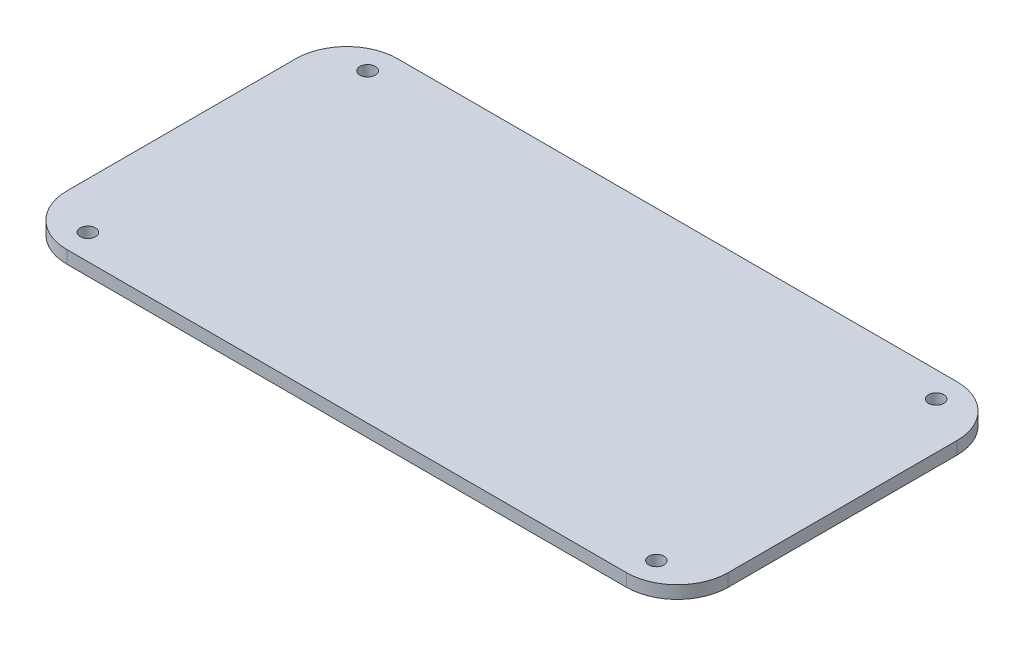
ISO-10303-21;
HEADER;
FILE_DESCRIPTION(('STEP AP214'),'2;1');
FILE_NAME('part.step','',(''),(''),'','','');
FILE_SCHEMA(('AUTOMOTIVE_DESIGN { 1 0 10303 214 1 1 1 1 }'));
ENDSEC;
DATA;
#1=APPLICATION_CONTEXT('core data for automotive mechanical design processes');
#2=APPLICATION_PROTOCOL_DEFINITION('international standard','automotive_design',2000,#1);
#3=PRODUCT_CONTEXT('',#1,'mechanical');
#4=PRODUCT('Part','Part','',(#3));
#5=PRODUCT_RELATED_PRODUCT_CATEGORY('part','',(#4));
#6=PRODUCT_DEFINITION_FORMATION('','',#4);
#7=PRODUCT_DEFINITION_CONTEXT('part definition',#1,'design');
#8=PRODUCT_DEFINITION('design','',#6,#7);
#9=PRODUCT_DEFINITION_SHAPE('','',#8);
#10=(LENGTH_UNIT() NAMED_UNIT(*) SI_UNIT(.MILLI.,.METRE.));
#11=(NAMED_UNIT(*) PLANE_ANGLE_UNIT() SI_UNIT($,.RADIAN.));
#12=(NAMED_UNIT(*) SI_UNIT($,.STERADIAN.) SOLID_ANGLE_UNIT());
#13=UNCERTAINTY_MEASURE_WITH_UNIT(LENGTH_MEASURE(1.E-05),#10,'distance_accuracy_value','');
#14=(GEOMETRIC_REPRESENTATION_CONTEXT(3) GLOBAL_UNCERTAINTY_ASSIGNED_CONTEXT((#13)) GLOBAL_UNIT_ASSIGNED_CONTEXT((#10,
#11,#12)) REPRESENTATION_CONTEXT('',''));
#15=CARTESIAN_POINT('',(0.,0.,0.));
#16=DIRECTION('',(0.,0.,1.));
#17=DIRECTION('',(1.,0.,0.));
#18=AXIS2_PLACEMENT_3D('',#15,#16,#17);
#19=CARTESIAN_POINT('',(10.,2.5,-55.));
#20=DIRECTION('',(0.,-1.,0.));
#21=DIRECTION('',(0.,0.,-1.));
#22=AXIS2_PLACEMENT_3D('',#19,#20,#21);
#23=CYLINDRICAL_SURFACE('',#22,10.);
#24=CARTESIAN_POINT('',(10.,0.,-55.));
#25=DIRECTION('',(0.,1.,0.));
#26=DIRECTION('',(0.,0.,1.));
#27=AXIS2_PLACEMENT_3D('',#24,#25,#26);
#28=CIRCLE('',#27,10.);
#29=CARTESIAN_POINT('',(10.,0.,-65.));
#30=VERTEX_POINT('',#29);
#31=CARTESIAN_POINT('',(0.,0.,-55.));
#32=VERTEX_POINT('',#31);
#33=EDGE_CURVE('E145',#30,#32,#28,.T.);
#34=ORIENTED_EDGE('',*,*,#33,.T.);
#35=DIRECTION('',(0.,-1.,0.));
#36=VECTOR('',#35,1.);
#37=CARTESIAN_POINT('',(0.,2.5,-55.));
#38=LINE('',#37,#36);
#39=CARTESIAN_POINT('',(0.,2.5,-55.));
#40=VERTEX_POINT('',#39);
#41=EDGE_CURVE('E11',#40,#32,#38,.T.);
#42=ORIENTED_EDGE('',*,*,#41,.F.);
#43=CARTESIAN_POINT('',(10.,2.5,-55.));
#44=DIRECTION('',(0.,1.,0.));
#45=DIRECTION('',(0.,0.,1.));
#46=AXIS2_PLACEMENT_3D('',#43,#44,#45);
#47=CIRCLE('',#46,10.);
#48=CARTESIAN_POINT('',(10.,2.5,-65.));
#49=VERTEX_POINT('',#48);
#50=EDGE_CURVE('E168',#49,#40,#47,.T.);
#51=ORIENTED_EDGE('',*,*,#50,.F.);
#52=DIRECTION('',(0.,-1.,0.));
#53=VECTOR('',#52,1.);
#54=CARTESIAN_POINT('',(10.,2.5,-65.));
#55=LINE('',#54,#53);
#56=EDGE_CURVE('E141',#49,#30,#55,.T.);
#57=ORIENTED_EDGE('',*,*,#56,.T.);
#58=EDGE_LOOP('',(#34,#42,#51,#57));
#59=FACE_BOUND('',#58,.T.);
#60=ADVANCED_FACE('F44',(#59),#23,.T.);
#61=CARTESIAN_POINT('',(0.,2.5,-10.0000000000001));
#62=DIRECTION('',(1.,0.,0.));
#63=DIRECTION('',(0.,0.,-1.));
#64=AXIS2_PLACEMENT_3D('',#61,#62,#63);
#65=PLANE('',#64);
#66=DIRECTION('',(0.,0.,1.));
#67=VECTOR('',#66,1.);
#68=CARTESIAN_POINT('',(0.,0.,-10.0000000000001));
#69=LINE('',#68,#67);
#70=CARTESIAN_POINT('',(0.,0.,-10.0000000000001));
#71=VERTEX_POINT('',#70);
#72=EDGE_CURVE('E149',#32,#71,#69,.T.);
#73=ORIENTED_EDGE('',*,*,#72,.T.);
#74=DIRECTION('',(0.,-1.,0.));
#75=VECTOR('',#74,1.);
#76=CARTESIAN_POINT('',(0.,2.5,-10.0000000000001));
#77=LINE('',#76,#75);
#78=CARTESIAN_POINT('',(0.,2.5,-10.0000000000001));
#79=VERTEX_POINT('',#78);
#80=EDGE_CURVE('E53',#79,#71,#77,.T.);
#81=ORIENTED_EDGE('',*,*,#80,.F.);
#82=DIRECTION('',(0.,0.,1.));
#83=VECTOR('',#82,1.);
#84=CARTESIAN_POINT('',(0.,2.5,-10.0000000000001));
#85=LINE('',#84,#83);
#86=EDGE_CURVE('E104',#40,#79,#85,.T.);
#87=ORIENTED_EDGE('',*,*,#86,.F.);
#88=ORIENTED_EDGE('',*,*,#41,.T.);
#89=EDGE_LOOP('',(#73,#81,#87,#88));
#90=FACE_BOUND('',#89,.T.);
#91=ADVANCED_FACE('F277',(#90),#65,.F.);
#92=CARTESIAN_POINT('',(10.,2.5,-10.));
#93=DIRECTION('',(0.,-1.,0.));
#94=DIRECTION('',(0.,0.,-1.));
#95=AXIS2_PLACEMENT_3D('',#92,#93,#94);
#96=CYLINDRICAL_SURFACE('',#95,10.);
#97=CARTESIAN_POINT('',(10.,0.,-10.));
#98=DIRECTION('',(0.,1.,0.));
#99=DIRECTION('',(0.,0.,1.));
#100=AXIS2_PLACEMENT_3D('',#97,#98,#99);
#101=CIRCLE('',#100,10.);
#102=CARTESIAN_POINT('',(10.0000000000001,0.,0.));
#103=VERTEX_POINT('',#102);
#104=EDGE_CURVE('E153',#71,#103,#101,.T.);
#105=ORIENTED_EDGE('',*,*,#104,.T.);
#106=DIRECTION('',(0.,-1.,0.));
#107=VECTOR('',#106,1.);
#108=CARTESIAN_POINT('',(10.0000000000001,2.5,0.));
#109=LINE('',#108,#107);
#110=CARTESIAN_POINT('',(10.0000000000001,2.5,0.));
#111=VERTEX_POINT('',#110);
#112=EDGE_CURVE('E179',#111,#103,#109,.T.);
#113=ORIENTED_EDGE('',*,*,#112,.F.);
#114=CARTESIAN_POINT('',(10.,2.5,-10.));
#115=DIRECTION('',(0.,1.,0.));
#116=DIRECTION('',(0.,0.,1.));
#117=AXIS2_PLACEMENT_3D('',#114,#115,#116);
#118=CIRCLE('',#117,10.);
#119=EDGE_CURVE('E189',#79,#111,#118,.T.);
#120=ORIENTED_EDGE('',*,*,#119,.F.);
#121=ORIENTED_EDGE('',*,*,#80,.T.);
#122=EDGE_LOOP('',(#105,#113,#120,#121));
#123=FACE_BOUND('',#122,.T.);
#124=ADVANCED_FACE('F187',(#123),#96,.T.);
#125=CARTESIAN_POINT('',(10.0000000000001,2.5,0.));
#126=DIRECTION('',(0.,0.,-1.));
#127=DIRECTION('',(-1.,0.,0.));
#128=AXIS2_PLACEMENT_3D('',#125,#126,#127);
#129=PLANE('',#128);
#130=DIRECTION('',(1.,0.,0.));
#131=VECTOR('',#130,1.);
#132=CARTESIAN_POINT('',(10.0000000000001,0.,0.));
#133=LINE('',#132,#131);
#134=CARTESIAN_POINT('',(120.,0.,0.));
#135=VERTEX_POINT('',#134);
#136=EDGE_CURVE('E156',#103,#135,#133,.T.);
#137=ORIENTED_EDGE('',*,*,#136,.T.);
#138=DIRECTION('',(0.,-1.,0.));
#139=VECTOR('',#138,1.);
#140=CARTESIAN_POINT('',(120.,2.5,0.));
#141=LINE('',#140,#139);
#142=CARTESIAN_POINT('',(120.,2.5,0.));
#143=VERTEX_POINT('',#142);
#144=EDGE_CURVE('E175',#143,#135,#141,.T.);
#145=ORIENTED_EDGE('',*,*,#144,.F.);
#146=DIRECTION('',(1.,0.,0.));
#147=VECTOR('',#146,1.);
#148=CARTESIAN_POINT('',(10.0000000000001,2.5,0.));
#149=LINE('',#148,#147);
#150=EDGE_CURVE('E202',#111,#143,#149,.T.);
#151=ORIENTED_EDGE('',*,*,#150,.F.);
#152=ORIENTED_EDGE('',*,*,#112,.T.);
#153=EDGE_LOOP('',(#137,#145,#151,#152));
#154=FACE_BOUND('',#153,.T.);
#155=ADVANCED_FACE('F197',(#154),#129,.F.);
#156=CARTESIAN_POINT('',(120.,2.5,-10.));
#157=DIRECTION('',(0.,-1.,0.));
#158=DIRECTION('',(0.,0.,-1.));
#159=AXIS2_PLACEMENT_3D('',#156,#157,#158);
#160=CYLINDRICAL_SURFACE('',#159,10.);
#161=CARTESIAN_POINT('',(120.,0.,-10.));
#162=DIRECTION('',(0.,1.,0.));
#163=DIRECTION('',(0.,0.,-1.));
#164=AXIS2_PLACEMENT_3D('',#161,#162,#163);
#165=CIRCLE('',#164,10.);
#166=CARTESIAN_POINT('',(130.,0.,-10.0000000000001));
#167=VERTEX_POINT('',#166);
#168=EDGE_CURVE('E159',#135,#167,#165,.T.);
#169=ORIENTED_EDGE('',*,*,#168,.T.);
#170=DIRECTION('',(0.,-1.,0.));
#171=VECTOR('',#170,1.);
#172=CARTESIAN_POINT('',(130.,2.5,-10.0000000000001));
#173=LINE('',#172,#171);
#174=CARTESIAN_POINT('',(130.,2.5,-10.0000000000001));
#175=VERTEX_POINT('',#174);
#176=EDGE_CURVE('E134',#175,#167,#173,.T.);
#177=ORIENTED_EDGE('',*,*,#176,.F.);
#178=CARTESIAN_POINT('',(120.,2.5,-10.));
#179=DIRECTION('',(0.,1.,0.));
#180=DIRECTION('',(0.,0.,-1.));
#181=AXIS2_PLACEMENT_3D('',#178,#179,#180);
#182=CIRCLE('',#181,10.);
#183=EDGE_CURVE('E123',#143,#175,#182,.T.);
#184=ORIENTED_EDGE('',*,*,#183,.F.);
#185=ORIENTED_EDGE('',*,*,#144,.T.);
#186=EDGE_LOOP('',(#169,#177,#184,#185));
#187=FACE_BOUND('',#186,.T.);
#188=ADVANCED_FACE('F200',(#187),#160,.T.);
#189=CARTESIAN_POINT('',(130.,2.5,-10.0000000000001));
#190=DIRECTION('',(-1.,0.,0.));
#191=DIRECTION('',(0.,0.,1.));
#192=AXIS2_PLACEMENT_3D('',#189,#190,#191);
#193=PLANE('',#192);
#194=DIRECTION('',(0.,0.,-1.));
#195=VECTOR('',#194,1.);
#196=CARTESIAN_POINT('',(130.,0.,-10.0000000000001));
#197=LINE('',#196,#195);
#198=CARTESIAN_POINT('',(130.,0.,-55.));
#199=VERTEX_POINT('',#198);
#200=EDGE_CURVE('E132',#167,#199,#197,.T.);
#201=ORIENTED_EDGE('',*,*,#200,.T.);
#202=DIRECTION('',(0.,-1.,0.));
#203=VECTOR('',#202,1.);
#204=CARTESIAN_POINT('',(130.,2.5,-55.));
#205=LINE('',#204,#203);
#206=CARTESIAN_POINT('',(130.,2.5,-55.));
#207=VERTEX_POINT('',#206);
#208=EDGE_CURVE('E129',#207,#199,#205,.T.);
#209=ORIENTED_EDGE('',*,*,#208,.F.);
#210=DIRECTION('',(0.,0.,-1.));
#211=VECTOR('',#210,1.);
#212=CARTESIAN_POINT('',(130.,2.5,-10.0000000000001));
#213=LINE('',#212,#211);
#214=EDGE_CURVE('E117',#175,#207,#213,.T.);
#215=ORIENTED_EDGE('',*,*,#214,.F.);
#216=ORIENTED_EDGE('',*,*,#176,.T.);
#217=EDGE_LOOP('',(#201,#209,#215,#216));
#218=FACE_BOUND('',#217,.T.);
#219=ADVANCED_FACE('F130',(#218),#193,.F.);
#220=CARTESIAN_POINT('',(120.,2.5,-55.));
#221=DIRECTION('',(0.,-1.,0.));
#222=DIRECTION('',(0.,0.,-1.));
#223=AXIS2_PLACEMENT_3D('',#220,#221,#222);
#224=CYLINDRICAL_SURFACE('',#223,10.);
#225=CARTESIAN_POINT('',(120.,0.,-55.));
#226=DIRECTION('',(0.,1.,0.));
#227=DIRECTION('',(0.,0.,-1.));
#228=AXIS2_PLACEMENT_3D('',#225,#226,#227);
#229=CIRCLE('',#228,10.);
#230=CARTESIAN_POINT('',(120.,0.,-65.));
#231=VERTEX_POINT('',#230);
#232=EDGE_CURVE('E90',#199,#231,#229,.T.);
#233=ORIENTED_EDGE('',*,*,#232,.T.);
#234=DIRECTION('',(0.,-1.,0.));
#235=VECTOR('',#234,1.);
#236=CARTESIAN_POINT('',(120.,2.5,-65.));
#237=LINE('',#236,#235);
#238=CARTESIAN_POINT('',(120.,2.5,-65.));
#239=VERTEX_POINT('',#238);
#240=EDGE_CURVE('E135',#239,#231,#237,.T.);
#241=ORIENTED_EDGE('',*,*,#240,.F.);
#242=CARTESIAN_POINT('',(120.,2.5,-55.));
#243=DIRECTION('',(0.,1.,0.));
#244=DIRECTION('',(0.,0.,-1.));
#245=AXIS2_PLACEMENT_3D('',#242,#243,#244);
#246=CIRCLE('',#245,10.);
#247=EDGE_CURVE('E121',#207,#239,#246,.T.);
#248=ORIENTED_EDGE('',*,*,#247,.F.);
#249=ORIENTED_EDGE('',*,*,#208,.T.);
#250=EDGE_LOOP('',(#233,#241,#248,#249));
#251=FACE_BOUND('',#250,.T.);
#252=ADVANCED_FACE('F137',(#251),#224,.T.);
#253=CARTESIAN_POINT('',(10.,2.5,-65.));
#254=DIRECTION('',(0.,0.,1.));
#255=DIRECTION('',(1.,0.,0.));
#256=AXIS2_PLACEMENT_3D('',#253,#254,#255);
#257=PLANE('',#256);
#258=DIRECTION('',(-1.,0.,0.));
#259=VECTOR('',#258,1.);
#260=CARTESIAN_POINT('',(10.,0.,-65.));
#261=LINE('',#260,#259);
#262=EDGE_CURVE('E96',#231,#30,#261,.T.);
#263=ORIENTED_EDGE('',*,*,#262,.T.);
#264=ORIENTED_EDGE('',*,*,#56,.F.);
#265=DIRECTION('',(-1.,0.,0.));
#266=VECTOR('',#265,1.);
#267=CARTESIAN_POINT('',(10.,2.5,-65.));
#268=LINE('',#267,#266);
#269=EDGE_CURVE('E61',#239,#49,#268,.T.);
#270=ORIENTED_EDGE('',*,*,#269,.F.);
#271=ORIENTED_EDGE('',*,*,#240,.T.);
#272=EDGE_LOOP('',(#263,#264,#270,#271));
#273=FACE_BOUND('',#272,.T.);
#274=ADVANCED_FACE('F255',(#273),#257,.F.);
#275=CARTESIAN_POINT('',(10.,2.5,-55.));
#276=DIRECTION('',(0.,1.,0.));
#277=DIRECTION('',(0.,0.,1.));
#278=AXIS2_PLACEMENT_3D('',#275,#276,#277);
#279=PLANE('',#278);
#280=CARTESIAN_POINT('',(120.887274,2.5,-60.));
#281=DIRECTION('',(0.,1.,0.));
#282=DIRECTION('',(0.,0.,-1.));
#283=AXIS2_PLACEMENT_3D('',#280,#281,#282);
#284=CIRCLE('',#283,1.5);
#285=CARTESIAN_POINT('',(120.887274,2.5,-61.5));
#286=VERTEX_POINT('',#285);
#287=EDGE_CURVE('E236',#286,#286,#284,.T.);
#288=ORIENTED_EDGE('',*,*,#287,.F.);
#289=EDGE_LOOP('',(#288));
#290=FACE_BOUND('',#289,.T.);
#291=CARTESIAN_POINT('',(120.887274,2.5,-5.00000000000001));
#292=DIRECTION('',(0.,1.,0.));
#293=DIRECTION('',(0.,0.,-1.));
#294=AXIS2_PLACEMENT_3D('',#291,#292,#293);
#295=CIRCLE('',#294,1.5);
#296=CARTESIAN_POINT('',(120.887274,2.5,-6.50000000000001));
#297=VERTEX_POINT('',#296);
#298=EDGE_CURVE('E228',#297,#297,#295,.T.);
#299=ORIENTED_EDGE('',*,*,#298,.F.);
#300=EDGE_LOOP('',(#299));
#301=FACE_BOUND('',#300,.T.);
#302=CARTESIAN_POINT('',(9.112726,2.5,-60.));
#303=DIRECTION('',(0.,1.,0.));
#304=DIRECTION('',(0.,0.,1.));
#305=AXIS2_PLACEMENT_3D('',#302,#303,#304);
#306=CIRCLE('',#305,1.5);
#307=CARTESIAN_POINT('',(9.112726,2.5,-58.5));
#308=VERTEX_POINT('',#307);
#309=EDGE_CURVE('E220',#308,#308,#306,.T.);
#310=ORIENTED_EDGE('',*,*,#309,.F.);
#311=EDGE_LOOP('',(#310));
#312=FACE_BOUND('',#311,.T.);
#313=CARTESIAN_POINT('',(9.112726,2.5,-5.));
#314=DIRECTION('',(0.,1.,0.));
#315=DIRECTION('',(0.,0.,1.));
#316=AXIS2_PLACEMENT_3D('',#313,#314,#315);
#317=CIRCLE('',#316,1.5);
#318=CARTESIAN_POINT('',(9.112726,2.5,-3.5));
#319=VERTEX_POINT('',#318);
#320=EDGE_CURVE('E212',#319,#319,#317,.T.);
#321=ORIENTED_EDGE('',*,*,#320,.F.);
#322=EDGE_LOOP('',(#321));
#323=FACE_BOUND('',#322,.T.);
#324=ORIENTED_EDGE('',*,*,#50,.T.);
#325=ORIENTED_EDGE('',*,*,#86,.T.);
#326=ORIENTED_EDGE('',*,*,#119,.T.);
#327=ORIENTED_EDGE('',*,*,#150,.T.);
#328=ORIENTED_EDGE('',*,*,#183,.T.);
#329=ORIENTED_EDGE('',*,*,#214,.T.);
#330=ORIENTED_EDGE('',*,*,#247,.T.);
#331=ORIENTED_EDGE('',*,*,#269,.T.);
#332=EDGE_LOOP('',(#324,#325,#326,#327,#328,#329,#330,#331));
#333=FACE_BOUND('',#332,.T.);
#334=ADVANCED_FACE('F119',(#290,#301,#312,#323,#333),#279,.T.);
#335=CARTESIAN_POINT('',(10.,0.,-55.));
#336=DIRECTION('',(0.,1.,0.));
#337=DIRECTION('',(0.,0.,1.));
#338=AXIS2_PLACEMENT_3D('',#335,#336,#337);
#339=PLANE('',#338);
#340=CARTESIAN_POINT('',(120.887274,0.,-60.));
#341=DIRECTION('',(0.,1.,0.));
#342=DIRECTION('',(0.,0.,-1.));
#343=AXIS2_PLACEMENT_3D('',#340,#341,#342);
#344=CIRCLE('',#343,1.5);
#345=CARTESIAN_POINT('',(120.887274,0.,-61.5));
#346=VERTEX_POINT('',#345);
#347=EDGE_CURVE('E232',#346,#346,#344,.T.);
#348=ORIENTED_EDGE('',*,*,#347,.T.);
#349=EDGE_LOOP('',(#348));
#350=FACE_BOUND('',#349,.T.);
#351=CARTESIAN_POINT('',(120.887274,0.,-5.00000000000001));
#352=DIRECTION('',(0.,1.,0.));
#353=DIRECTION('',(0.,0.,-1.));
#354=AXIS2_PLACEMENT_3D('',#351,#352,#353);
#355=CIRCLE('',#354,1.5);
#356=CARTESIAN_POINT('',(120.887274,0.,-6.50000000000001));
#357=VERTEX_POINT('',#356);
#358=EDGE_CURVE('E224',#357,#357,#355,.T.);
#359=ORIENTED_EDGE('',*,*,#358,.T.);
#360=EDGE_LOOP('',(#359));
#361=FACE_BOUND('',#360,.T.);
#362=CARTESIAN_POINT('',(9.112726,0.,-60.));
#363=DIRECTION('',(0.,1.,0.));
#364=DIRECTION('',(0.,0.,1.));
#365=AXIS2_PLACEMENT_3D('',#362,#363,#364);
#366=CIRCLE('',#365,1.5);
#367=CARTESIAN_POINT('',(9.112726,0.,-58.5));
#368=VERTEX_POINT('',#367);
#369=EDGE_CURVE('E216',#368,#368,#366,.T.);
#370=ORIENTED_EDGE('',*,*,#369,.T.);
#371=EDGE_LOOP('',(#370));
#372=FACE_BOUND('',#371,.T.);
#373=CARTESIAN_POINT('',(9.112726,0.,-5.));
#374=DIRECTION('',(0.,1.,0.));
#375=DIRECTION('',(0.,0.,1.));
#376=AXIS2_PLACEMENT_3D('',#373,#374,#375);
#377=CIRCLE('',#376,1.5);
#378=CARTESIAN_POINT('',(9.112726,0.,-3.5));
#379=VERTEX_POINT('',#378);
#380=EDGE_CURVE('E150',#379,#379,#377,.T.);
#381=ORIENTED_EDGE('',*,*,#380,.T.);
#382=EDGE_LOOP('',(#381));
#383=FACE_BOUND('',#382,.T.);
#384=ORIENTED_EDGE('',*,*,#33,.F.);
#385=ORIENTED_EDGE('',*,*,#262,.F.);
#386=ORIENTED_EDGE('',*,*,#232,.F.);
#387=ORIENTED_EDGE('',*,*,#200,.F.);
#388=ORIENTED_EDGE('',*,*,#168,.F.);
#389=ORIENTED_EDGE('',*,*,#136,.F.);
#390=ORIENTED_EDGE('',*,*,#104,.F.);
#391=ORIENTED_EDGE('',*,*,#72,.F.);
#392=EDGE_LOOP('',(#384,#385,#386,#387,#388,#389,#390,#391));
#393=FACE_BOUND('',#392,.T.);
#394=ADVANCED_FACE('F193',(#350,#361,#372,#383,#393),#339,.F.);
#395=CARTESIAN_POINT('',(9.112726,0.,-5.));
#396=DIRECTION('',(0.,1.,0.));
#397=DIRECTION('',(0.,0.,1.));
#398=AXIS2_PLACEMENT_3D('',#395,#396,#397);
#399=CYLINDRICAL_SURFACE('',#398,1.5);
#400=ORIENTED_EDGE('',*,*,#380,.F.);
#401=EDGE_LOOP('',(#400));
#402=FACE_BOUND('',#401,.T.);
#403=ORIENTED_EDGE('',*,*,#320,.T.);
#404=EDGE_LOOP('',(#403));
#405=FACE_BOUND('',#404,.T.);
#406=ADVANCED_FACE('F263',(#402,#405),#399,.F.);
#407=CARTESIAN_POINT('',(9.112726,0.,-60.));
#408=DIRECTION('',(0.,1.,0.));
#409=DIRECTION('',(0.,0.,1.));
#410=AXIS2_PLACEMENT_3D('',#407,#408,#409);
#411=CYLINDRICAL_SURFACE('',#410,1.5);
#412=ORIENTED_EDGE('',*,*,#369,.F.);
#413=EDGE_LOOP('',(#412));
#414=FACE_BOUND('',#413,.T.);
#415=ORIENTED_EDGE('',*,*,#309,.T.);
#416=EDGE_LOOP('',(#415));
#417=FACE_BOUND('',#416,.T.);
#418=ADVANCED_FACE('F265',(#414,#417),#411,.F.);
#419=CARTESIAN_POINT('',(120.887274,0.,-5.00000000000001));
#420=DIRECTION('',(0.,1.,0.));
#421=DIRECTION('',(0.,0.,1.));
#422=AXIS2_PLACEMENT_3D('',#419,#420,#421);
#423=CYLINDRICAL_SURFACE('',#422,1.5);
#424=ORIENTED_EDGE('',*,*,#358,.F.);
#425=EDGE_LOOP('',(#424));
#426=FACE_BOUND('',#425,.T.);
#427=ORIENTED_EDGE('',*,*,#298,.T.);
#428=EDGE_LOOP('',(#427));
#429=FACE_BOUND('',#428,.T.);
#430=ADVANCED_FACE('F249',(#426,#429),#423,.F.);
#431=CARTESIAN_POINT('',(120.887274,0.,-60.));
#432=DIRECTION('',(0.,1.,0.));
#433=DIRECTION('',(0.,0.,1.));
#434=AXIS2_PLACEMENT_3D('',#431,#432,#433);
#435=CYLINDRICAL_SURFACE('',#434,1.5);
#436=ORIENTED_EDGE('',*,*,#347,.F.);
#437=EDGE_LOOP('',(#436));
#438=FACE_BOUND('',#437,.T.);
#439=ORIENTED_EDGE('',*,*,#287,.T.);
#440=EDGE_LOOP('',(#439));
#441=FACE_BOUND('',#440,.T.);
#442=ADVANCED_FACE('F246',(#438,#441),#435,.F.);
#443=CLOSED_SHELL('',(#60,#91,#124,#155,#188,#219,#252,#274,#334,#394,#406,#418,#430,#442));
#444=MANIFOLD_SOLID_BREP('B2',#443);
#445=ADVANCED_BREP_SHAPE_REPRESENTATION('',(#18,#444),#14);
#446=SHAPE_DEFINITION_REPRESENTATION(#9,#445);
ENDSEC;
END-ISO-10303-21;
